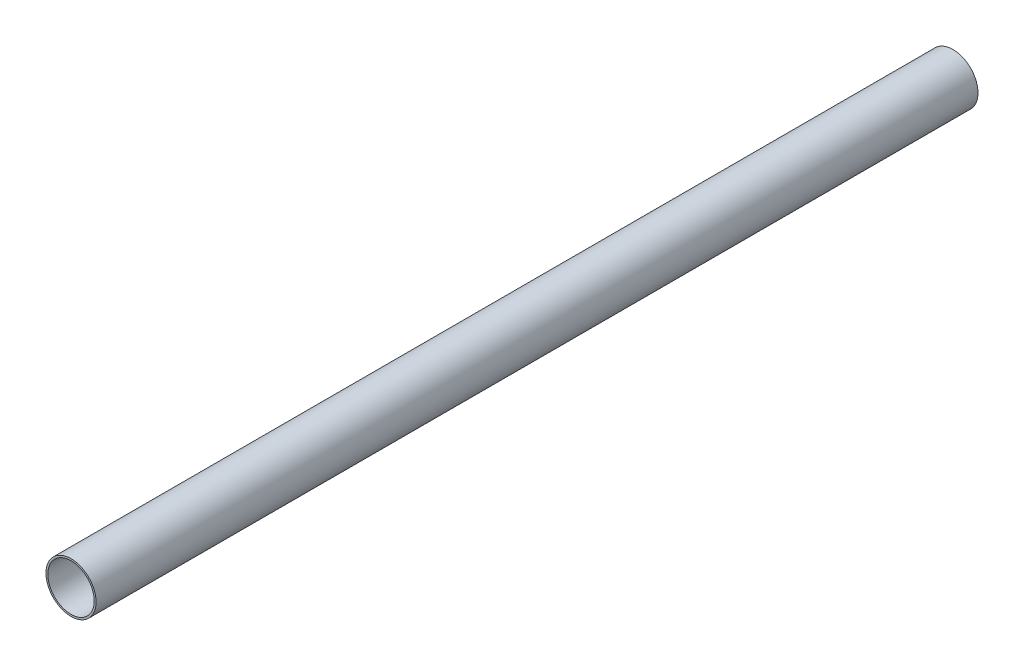
ISO-10303-21;
HEADER;
FILE_DESCRIPTION(('STEP AP214'),'2;1');
FILE_NAME('part.step','',(''),(''),'','','');
FILE_SCHEMA(('AUTOMOTIVE_DESIGN { 1 0 10303 214 1 1 1 1 }'));
ENDSEC;
DATA;
#1=APPLICATION_CONTEXT('core data for automotive mechanical design processes');
#2=APPLICATION_PROTOCOL_DEFINITION('international standard','automotive_design',2000,#1);
#3=PRODUCT_CONTEXT('',#1,'mechanical');
#4=PRODUCT('Part','Part','',(#3));
#5=PRODUCT_RELATED_PRODUCT_CATEGORY('part','',(#4));
#6=PRODUCT_DEFINITION_FORMATION('','',#4);
#7=PRODUCT_DEFINITION_CONTEXT('part definition',#1,'design');
#8=PRODUCT_DEFINITION('design','',#6,#7);
#9=PRODUCT_DEFINITION_SHAPE('','',#8);
#10=(LENGTH_UNIT() NAMED_UNIT(*) SI_UNIT(.MILLI.,.METRE.));
#11=(NAMED_UNIT(*) PLANE_ANGLE_UNIT() SI_UNIT($,.RADIAN.));
#12=(NAMED_UNIT(*) SI_UNIT($,.STERADIAN.) SOLID_ANGLE_UNIT());
#13=UNCERTAINTY_MEASURE_WITH_UNIT(LENGTH_MEASURE(1.E-05),#10,'distance_accuracy_value','');
#14=(GEOMETRIC_REPRESENTATION_CONTEXT(3) GLOBAL_UNCERTAINTY_ASSIGNED_CONTEXT((#13)) GLOBAL_UNIT_ASSIGNED_CONTEXT((#10,
#11,#12)) REPRESENTATION_CONTEXT('',''));
#15=CARTESIAN_POINT('',(0.,0.,0.));
#16=DIRECTION('',(0.,0.,1.));
#17=DIRECTION('',(1.,0.,0.));
#18=AXIS2_PLACEMENT_3D('',#15,#16,#17);
#19=CARTESIAN_POINT('',(0.,0.,-1900.));
#20=DIRECTION('',(0.,0.,1.));
#21=DIRECTION('',(1.,0.,0.));
#22=AXIS2_PLACEMENT_3D('',#19,#20,#21);
#23=CYLINDRICAL_SURFACE('',#22,50.);
#24=CARTESIAN_POINT('',(0.,0.,-1900.));
#25=DIRECTION('',(0.,0.,-1.));
#26=DIRECTION('',(-1.,0.,0.));
#27=AXIS2_PLACEMENT_3D('',#24,#25,#26);
#28=CIRCLE('',#27,50.);
#29=CARTESIAN_POINT('',(50.,0.,-1900.));
#30=VERTEX_POINT('',#29);
#31=EDGE_CURVE('E55',#30,#30,#28,.T.);
#32=CARTESIAN_POINT('',(0.,0.,0.));
#33=DIRECTION('',(0.,0.,-1.));
#34=DIRECTION('',(-1.,0.,0.));
#35=AXIS2_PLACEMENT_3D('',#32,#33,#34);
#36=CIRCLE('',#35,50.);
#37=CARTESIAN_POINT('',(50.,0.,2.22044604925031E-13));
#38=VERTEX_POINT('',#37);
#39=EDGE_CURVE('E61',#38,#38,#36,.T.);
#40=CARTESIAN_POINT('',(50.,0.,-1900.));
#41=CARTESIAN_POINT('',(50.,0.,-1880.20833333333));
#42=CARTESIAN_POINT('',(50.,0.,-1860.41666666667));
#43=CARTESIAN_POINT('',(50.,0.,-1820.83333333333));
#44=CARTESIAN_POINT('',(50.,0.,-1801.04166666667));
#45=CARTESIAN_POINT('',(50.,0.,-1761.45833333333));
#46=CARTESIAN_POINT('',(50.,0.,-1741.66666666667));
#47=CARTESIAN_POINT('',(50.,0.,-1702.08333333333));
#48=CARTESIAN_POINT('',(50.,0.,-1682.29166666667));
#49=CARTESIAN_POINT('',(50.,0.,-1642.70833333333));
#50=CARTESIAN_POINT('',(50.,0.,-1622.91666666667));
#51=CARTESIAN_POINT('',(50.,0.,-1583.33333333333));
#52=CARTESIAN_POINT('',(50.,0.,-1563.54166666667));
#53=CARTESIAN_POINT('',(50.,0.,-1523.95833333333));
#54=CARTESIAN_POINT('',(50.,0.,-1504.16666666667));
#55=CARTESIAN_POINT('',(50.,0.,-1464.58333333333));
#56=CARTESIAN_POINT('',(50.,0.,-1444.79166666667));
#57=CARTESIAN_POINT('',(50.,0.,-1405.20833333333));
#58=CARTESIAN_POINT('',(50.,0.,-1385.41666666667));
#59=CARTESIAN_POINT('',(50.,0.,-1345.83333333333));
#60=CARTESIAN_POINT('',(50.,0.,-1326.04166666667));
#61=CARTESIAN_POINT('',(50.,0.,-1286.45833333333));
#62=CARTESIAN_POINT('',(50.,0.,-1266.66666666667));
#63=CARTESIAN_POINT('',(50.,0.,-1227.08333333333));
#64=CARTESIAN_POINT('',(50.,0.,-1207.29166666667));
#65=CARTESIAN_POINT('',(50.,0.,-1167.70833333333));
#66=CARTESIAN_POINT('',(50.,0.,-1147.91666666667));
#67=CARTESIAN_POINT('',(50.,0.,-1108.33333333333));
#68=CARTESIAN_POINT('',(50.,0.,-1088.54166666667));
#69=CARTESIAN_POINT('',(50.,0.,-1048.95833333333));
#70=CARTESIAN_POINT('',(50.,0.,-1029.16666666667));
#71=CARTESIAN_POINT('',(50.,0.,-989.583333333333));
#72=CARTESIAN_POINT('',(50.,0.,-969.791666666667));
#73=CARTESIAN_POINT('',(50.,0.,-930.208333333333));
#74=CARTESIAN_POINT('',(50.,0.,-910.416666666666));
#75=CARTESIAN_POINT('',(50.,0.,-870.833333333333));
#76=CARTESIAN_POINT('',(50.,0.,-851.041666666667));
#77=CARTESIAN_POINT('',(50.,0.,-811.458333333333));
#78=CARTESIAN_POINT('',(50.,0.,-791.666666666667));
#79=CARTESIAN_POINT('',(50.,0.,-752.083333333333));
#80=CARTESIAN_POINT('',(50.,0.,-732.291666666667));
#81=CARTESIAN_POINT('',(50.,0.,-692.708333333333));
#82=CARTESIAN_POINT('',(50.,0.,-672.916666666667));
#83=CARTESIAN_POINT('',(50.,0.,-633.333333333333));
#84=CARTESIAN_POINT('',(50.,0.,-613.541666666666));
#85=CARTESIAN_POINT('',(50.,0.,-573.958333333333));
#86=CARTESIAN_POINT('',(50.,0.,-554.166666666667));
#87=CARTESIAN_POINT('',(50.,0.,-514.583333333333));
#88=CARTESIAN_POINT('',(50.,0.,-494.791666666667));
#89=CARTESIAN_POINT('',(50.,0.,-455.208333333333));
#90=CARTESIAN_POINT('',(50.,0.,-435.416666666667));
#91=CARTESIAN_POINT('',(50.,0.,-395.833333333333));
#92=CARTESIAN_POINT('',(50.,0.,-376.041666666666));
#93=CARTESIAN_POINT('',(50.,0.,-336.458333333333));
#94=CARTESIAN_POINT('',(50.,0.,-316.666666666666));
#95=CARTESIAN_POINT('',(50.,0.,-277.083333333333));
#96=CARTESIAN_POINT('',(50.,0.,-257.291666666666));
#97=CARTESIAN_POINT('',(50.,0.,-217.708333333333));
#98=CARTESIAN_POINT('',(50.,0.,-197.916666666667));
#99=CARTESIAN_POINT('',(50.,0.,-158.333333333333));
#100=CARTESIAN_POINT('',(50.,0.,-138.541666666666));
#101=CARTESIAN_POINT('',(50.,0.,-98.958333333333));
#102=CARTESIAN_POINT('',(50.,0.,-79.1666666666664));
#103=CARTESIAN_POINT('',(50.,0.,-39.5833333333331));
#104=CARTESIAN_POINT('',(50.,0.,-19.7916666666664));
#105=CARTESIAN_POINT('',(50.,0.,2.22044604925031E-13));
#106=B_SPLINE_CURVE_WITH_KNOTS('',3,(#40,#41,#42,#43,#44,#45,#46,#47,#48,#49,#50,#51,#52,#53,
#54,#55,#56,#57,#58,#59,#60,#61,#62,#63,#64,#65,#66,#67,#68,#69,#70,#71,#72,#73,#74,#75,#76,#77,
#78,#79,#80,#81,#82,#83,#84,#85,#86,#87,#88,#89,#90,#91,#92,#93,#94,#95,#96,#97,#98,#99,#100,
#101,#102,#103,#104,#105),.UNSPECIFIED.,.F.,.F.,(4,2,2,2,2,2,2,2,2,2,2,2,2,2,2,2,2,2,2,2,2,2,2,
2,2,2,2,2,2,2,2,2,4),(0.,59.375,118.75,178.125,237.5,296.875,356.25,415.625,475.,534.375,593.75,
653.125,712.5,771.875,831.25,890.625,950.,1009.375,1068.75,1128.125,1187.5,1246.875,1306.25,
1365.625,1425.,1484.375,1543.75,1603.125,1662.5,1721.875,1781.25,1840.625,1900.),.UNSPECIFIED.);
#107=EDGE_CURVE('BSEAM48',#30,#38,#106,.T.);
#108=ORIENTED_EDGE('',*,*,#31,.T.);
#109=ORIENTED_EDGE('',*,*,#39,.F.);
#110=ORIENTED_EDGE('',*,*,#107,.T.);
#111=ORIENTED_EDGE('',*,*,#107,.F.);
#112=EDGE_LOOP('',(#108,#110,#109,#111));
#113=FACE_BOUND('',#112,.T.);
#114=ADVANCED_FACE('F48',(#113),#23,.F.);
#115=CARTESIAN_POINT('',(0.,0.,-1900.));
#116=DIRECTION('',(0.,0.,1.));
#117=DIRECTION('',(1.,0.,0.));
#118=AXIS2_PLACEMENT_3D('',#115,#116,#117);
#119=CYLINDRICAL_SURFACE('',#118,54.);
#120=CARTESIAN_POINT('',(0.,0.,-1900.));
#121=DIRECTION('',(0.,0.,-1.));
#122=DIRECTION('',(-1.,0.,0.));
#123=AXIS2_PLACEMENT_3D('',#120,#121,#122);
#124=CIRCLE('',#123,54.);
#125=CARTESIAN_POINT('',(54.,0.,-1900.));
#126=VERTEX_POINT('',#125);
#127=EDGE_CURVE('E11',#126,#126,#124,.T.);
#128=CARTESIAN_POINT('',(0.,0.,0.));
#129=DIRECTION('',(0.,0.,-1.));
#130=DIRECTION('',(-1.,0.,0.));
#131=AXIS2_PLACEMENT_3D('',#128,#129,#130);
#132=CIRCLE('',#131,54.);
#133=CARTESIAN_POINT('',(54.,0.,2.22044604925031E-13));
#134=VERTEX_POINT('',#133);
#135=EDGE_CURVE('E51',#134,#134,#132,.T.);
#136=CARTESIAN_POINT('',(54.,0.,-1900.));
#137=CARTESIAN_POINT('',(54.,0.,-1880.20833333333));
#138=CARTESIAN_POINT('',(54.,0.,-1860.41666666667));
#139=CARTESIAN_POINT('',(54.,0.,-1820.83333333333));
#140=CARTESIAN_POINT('',(54.,0.,-1801.04166666667));
#141=CARTESIAN_POINT('',(54.,0.,-1761.45833333333));
#142=CARTESIAN_POINT('',(54.,0.,-1741.66666666667));
#143=CARTESIAN_POINT('',(54.,0.,-1702.08333333333));
#144=CARTESIAN_POINT('',(54.,0.,-1682.29166666667));
#145=CARTESIAN_POINT('',(54.,0.,-1642.70833333333));
#146=CARTESIAN_POINT('',(54.,0.,-1622.91666666667));
#147=CARTESIAN_POINT('',(54.,0.,-1583.33333333333));
#148=CARTESIAN_POINT('',(54.,0.,-1563.54166666667));
#149=CARTESIAN_POINT('',(54.,0.,-1523.95833333333));
#150=CARTESIAN_POINT('',(54.,0.,-1504.16666666667));
#151=CARTESIAN_POINT('',(54.,0.,-1464.58333333333));
#152=CARTESIAN_POINT('',(54.,0.,-1444.79166666667));
#153=CARTESIAN_POINT('',(54.,0.,-1405.20833333333));
#154=CARTESIAN_POINT('',(54.,0.,-1385.41666666667));
#155=CARTESIAN_POINT('',(54.,0.,-1345.83333333333));
#156=CARTESIAN_POINT('',(54.,0.,-1326.04166666667));
#157=CARTESIAN_POINT('',(54.,0.,-1286.45833333333));
#158=CARTESIAN_POINT('',(54.,0.,-1266.66666666667));
#159=CARTESIAN_POINT('',(54.,0.,-1227.08333333333));
#160=CARTESIAN_POINT('',(54.,0.,-1207.29166666667));
#161=CARTESIAN_POINT('',(54.,0.,-1167.70833333333));
#162=CARTESIAN_POINT('',(54.,0.,-1147.91666666667));
#163=CARTESIAN_POINT('',(54.,0.,-1108.33333333333));
#164=CARTESIAN_POINT('',(54.,0.,-1088.54166666667));
#165=CARTESIAN_POINT('',(54.,0.,-1048.95833333333));
#166=CARTESIAN_POINT('',(54.,0.,-1029.16666666667));
#167=CARTESIAN_POINT('',(54.,0.,-989.583333333333));
#168=CARTESIAN_POINT('',(54.,0.,-969.791666666666));
#169=CARTESIAN_POINT('',(54.,0.,-930.208333333333));
#170=CARTESIAN_POINT('',(54.,0.,-910.416666666667));
#171=CARTESIAN_POINT('',(54.,0.,-870.833333333333));
#172=CARTESIAN_POINT('',(54.,0.,-851.041666666667));
#173=CARTESIAN_POINT('',(54.,0.,-811.458333333333));
#174=CARTESIAN_POINT('',(54.,0.,-791.666666666667));
#175=CARTESIAN_POINT('',(54.,0.,-752.083333333333));
#176=CARTESIAN_POINT('',(54.,0.,-732.291666666667));
#177=CARTESIAN_POINT('',(54.,0.,-692.708333333333));
#178=CARTESIAN_POINT('',(54.,0.,-672.916666666667));
#179=CARTESIAN_POINT('',(54.,0.,-633.333333333333));
#180=CARTESIAN_POINT('',(54.,0.,-613.541666666667));
#181=CARTESIAN_POINT('',(54.,0.,-573.958333333333));
#182=CARTESIAN_POINT('',(54.,0.,-554.166666666667));
#183=CARTESIAN_POINT('',(54.,0.,-514.583333333333));
#184=CARTESIAN_POINT('',(54.,0.,-494.791666666667));
#185=CARTESIAN_POINT('',(54.,0.,-455.208333333333));
#186=CARTESIAN_POINT('',(54.,0.,-435.416666666667));
#187=CARTESIAN_POINT('',(54.,0.,-395.833333333333));
#188=CARTESIAN_POINT('',(54.,0.,-376.041666666667));
#189=CARTESIAN_POINT('',(54.,0.,-336.458333333333));
#190=CARTESIAN_POINT('',(54.,0.,-316.666666666666));
#191=CARTESIAN_POINT('',(54.,0.,-277.083333333333));
#192=CARTESIAN_POINT('',(54.,0.,-257.291666666666));
#193=CARTESIAN_POINT('',(54.,0.,-217.708333333333));
#194=CARTESIAN_POINT('',(54.,0.,-197.916666666667));
#195=CARTESIAN_POINT('',(54.,0.,-158.333333333333));
#196=CARTESIAN_POINT('',(54.,0.,-138.541666666666));
#197=CARTESIAN_POINT('',(54.,0.,-98.958333333333));
#198=CARTESIAN_POINT('',(54.,0.,-79.1666666666664));
#199=CARTESIAN_POINT('',(54.,0.,-39.5833333333331));
#200=CARTESIAN_POINT('',(54.,0.,-19.7916666666664));
#201=CARTESIAN_POINT('',(54.,0.,2.22044604925031E-13));
#202=B_SPLINE_CURVE_WITH_KNOTS('',3,(#136,#137,#138,#139,#140,#141,#142,#143,#144,#145,#146,
#147,#148,#149,#150,#151,#152,#153,#154,#155,#156,#157,#158,#159,#160,#161,#162,#163,#164,#165,
#166,#167,#168,#169,#170,#171,#172,#173,#174,#175,#176,#177,#178,#179,#180,#181,#182,#183,#184,
#185,#186,#187,#188,#189,#190,#191,#192,#193,#194,#195,#196,#197,#198,#199,#200,#201),
.UNSPECIFIED.,.F.,.F.,(4,2,2,2,2,2,2,2,2,2,2,2,2,2,2,2,2,2,2,2,2,2,2,2,2,2,2,2,2,2,2,2,4),(0.,
59.3750000000002,118.75,178.125,237.5,296.875,356.25,415.625,475.,534.375,593.75,653.125,712.5,
771.875,831.25,890.625,950.,1009.375,1068.75,1128.125,1187.5,1246.875,1306.25,1365.625,1425.,
1484.375,1543.75,1603.125,1662.5,1721.875,1781.25,1840.625,1900.),.UNSPECIFIED.);
#203=EDGE_CURVE('BSEAM68',#126,#134,#202,.T.);
#204=ORIENTED_EDGE('',*,*,#127,.F.);
#205=ORIENTED_EDGE('',*,*,#135,.T.);
#206=ORIENTED_EDGE('',*,*,#203,.T.);
#207=ORIENTED_EDGE('',*,*,#203,.F.);
#208=EDGE_LOOP('',(#204,#206,#205,#207));
#209=FACE_BOUND('',#208,.T.);
#210=ADVANCED_FACE('F68',(#209),#119,.T.);
#211=CARTESIAN_POINT('',(0.,0.,-1900.));
#212=DIRECTION('',(0.,0.,-1.));
#213=DIRECTION('',(-1.,0.,0.));
#214=AXIS2_PLACEMENT_3D('',#211,#212,#213);
#215=PLANE('',#214);
#216=ORIENTED_EDGE('',*,*,#31,.F.);
#217=EDGE_LOOP('',(#216));
#218=FACE_BOUND('',#217,.T.);
#219=ORIENTED_EDGE('',*,*,#127,.T.);
#220=EDGE_LOOP('',(#219));
#221=FACE_BOUND('',#220,.T.);
#222=ADVANCED_FACE('F72',(#218,#221),#215,.T.);
#223=CARTESIAN_POINT('',(0.,0.,0.));
#224=DIRECTION('',(0.,0.,-1.));
#225=DIRECTION('',(-1.,0.,0.));
#226=AXIS2_PLACEMENT_3D('',#223,#224,#225);
#227=PLANE('',#226);
#228=ORIENTED_EDGE('',*,*,#39,.T.);
#229=EDGE_LOOP('',(#228));
#230=FACE_BOUND('',#229,.T.);
#231=ORIENTED_EDGE('',*,*,#135,.F.);
#232=EDGE_LOOP('',(#231));
#233=FACE_BOUND('',#232,.T.);
#234=ADVANCED_FACE('F70',(#230,#233),#227,.F.);
#235=CLOSED_SHELL('',(#114,#210,#222,#234));
#236=MANIFOLD_SOLID_BREP('B2',#235);
#237=ADVANCED_BREP_SHAPE_REPRESENTATION('',(#18,#236),#14);
#238=SHAPE_DEFINITION_REPRESENTATION(#9,#237);
ENDSEC;
END-ISO-10303-21;
